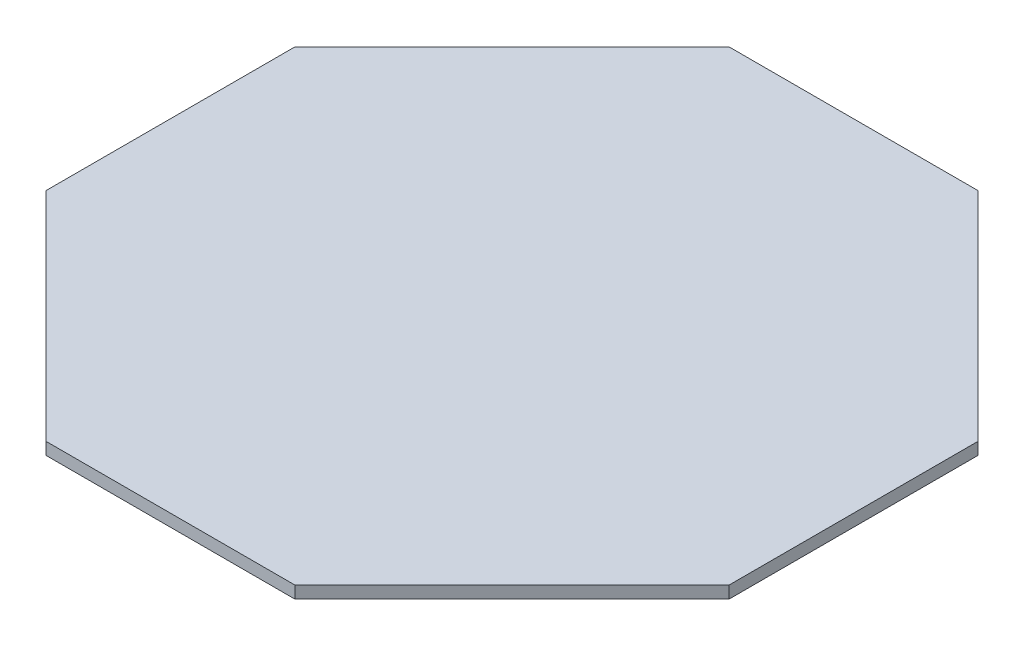
ISO-10303-21;
HEADER;
FILE_DESCRIPTION(('STEP AP214'),'2;1');
FILE_NAME('part.step','',(''),(''),'','','');
FILE_SCHEMA(('AUTOMOTIVE_DESIGN { 1 0 10303 214 1 1 1 1 }'));
ENDSEC;
DATA;
#1=APPLICATION_CONTEXT('core data for automotive mechanical design processes');
#2=APPLICATION_PROTOCOL_DEFINITION('international standard','automotive_design',2000,#1);
#3=PRODUCT_CONTEXT('',#1,'mechanical');
#4=PRODUCT('Part','Part','',(#3));
#5=PRODUCT_RELATED_PRODUCT_CATEGORY('part','',(#4));
#6=PRODUCT_DEFINITION_FORMATION('','',#4);
#7=PRODUCT_DEFINITION_CONTEXT('part definition',#1,'design');
#8=PRODUCT_DEFINITION('design','',#6,#7);
#9=PRODUCT_DEFINITION_SHAPE('','',#8);
#10=(LENGTH_UNIT() NAMED_UNIT(*) SI_UNIT(.MILLI.,.METRE.));
#11=(NAMED_UNIT(*) PLANE_ANGLE_UNIT() SI_UNIT($,.RADIAN.));
#12=(NAMED_UNIT(*) SI_UNIT($,.STERADIAN.) SOLID_ANGLE_UNIT());
#13=UNCERTAINTY_MEASURE_WITH_UNIT(LENGTH_MEASURE(1.E-05),#10,'distance_accuracy_value','');
#14=(GEOMETRIC_REPRESENTATION_CONTEXT(3) GLOBAL_UNCERTAINTY_ASSIGNED_CONTEXT((#13)) GLOBAL_UNIT_ASSIGNED_CONTEXT((#10,
#11,#12)) REPRESENTATION_CONTEXT('',''));
#15=CARTESIAN_POINT('',(0.,0.,0.));
#16=DIRECTION('',(0.,0.,1.));
#17=DIRECTION('',(1.,0.,0.));
#18=AXIS2_PLACEMENT_3D('',#15,#16,#17);
#19=CARTESIAN_POINT('',(-582.771529665369,2.875,-203.94755613606));
#20=DIRECTION('',(0.707106781186547,0.,0.707106781186548));
#21=DIRECTION('',(0.707106781186548,0.,-0.707106781186547));
#22=AXIS2_PLACEMENT_3D('',#19,#20,#21);
#23=PLANE('',#22);
#24=DIRECTION('',(-0.707106781186548,0.,0.707106781186547));
#25=VECTOR('',#24,1.);
#26=CARTESIAN_POINT('',(-582.771529665369,2.125,-203.94755613606));
#27=LINE('',#26,#25);
#28=CARTESIAN_POINT('',(-569.421529665369,2.125,-217.297556136059));
#29=VERTEX_POINT('',#28);
#30=CARTESIAN_POINT('',(-582.771529665369,2.125,-203.94755613606));
#31=VERTEX_POINT('',#30);
#32=EDGE_CURVE('E132',#29,#31,#27,.T.);
#33=ORIENTED_EDGE('',*,*,#32,.T.);
#34=DIRECTION('',(0.,-1.,0.));
#35=VECTOR('',#34,1.);
#36=CARTESIAN_POINT('',(-582.771529665369,2.875,-203.94755613606));
#37=LINE('',#36,#35);
#38=CARTESIAN_POINT('',(-582.771529665369,2.875,-203.94755613606));
#39=VERTEX_POINT('',#38);
#40=EDGE_CURVE('E11',#39,#31,#37,.T.);
#41=ORIENTED_EDGE('',*,*,#40,.F.);
#42=DIRECTION('',(-0.707106781186548,0.,0.707106781186547));
#43=VECTOR('',#42,1.);
#44=CARTESIAN_POINT('',(-582.771529665369,2.875,-203.94755613606));
#45=LINE('',#44,#43);
#46=CARTESIAN_POINT('',(-569.421529665369,2.875,-217.297556136059));
#47=VERTEX_POINT('',#46);
#48=EDGE_CURVE('E146',#47,#39,#45,.T.);
#49=ORIENTED_EDGE('',*,*,#48,.F.);
#50=DIRECTION('',(0.,-1.,0.));
#51=VECTOR('',#50,1.);
#52=CARTESIAN_POINT('',(-569.421529665369,2.875,-217.297556136059));
#53=LINE('',#52,#51);
#54=EDGE_CURVE('E128',#47,#29,#53,.T.);
#55=ORIENTED_EDGE('',*,*,#54,.T.);
#56=EDGE_LOOP('',(#33,#41,#49,#55));
#57=FACE_BOUND('',#56,.T.);
#58=ADVANCED_FACE('F36',(#57),#23,.F.);
#59=CARTESIAN_POINT('',(-582.771529665368,2.875,-188.64755613606));
#60=DIRECTION('',(1.,0.,0.));
#61=DIRECTION('',(0.,0.,-1.));
#62=AXIS2_PLACEMENT_3D('',#59,#60,#61);
#63=PLANE('',#62);
#64=DIRECTION('',(0.,0.,1.));
#65=VECTOR('',#64,1.);
#66=CARTESIAN_POINT('',(-582.771529665368,2.125,-188.64755613606));
#67=LINE('',#66,#65);
#68=CARTESIAN_POINT('',(-582.771529665368,2.125,-188.64755613606));
#69=VERTEX_POINT('',#68);
#70=EDGE_CURVE('E135',#31,#69,#67,.T.);
#71=ORIENTED_EDGE('',*,*,#70,.T.);
#72=DIRECTION('',(0.,-1.,0.));
#73=VECTOR('',#72,1.);
#74=CARTESIAN_POINT('',(-582.771529665368,2.875,-188.64755613606));
#75=LINE('',#74,#73);
#76=CARTESIAN_POINT('',(-582.771529665368,2.875,-188.64755613606));
#77=VERTEX_POINT('',#76);
#78=EDGE_CURVE('E44',#77,#69,#75,.T.);
#79=ORIENTED_EDGE('',*,*,#78,.F.);
#80=DIRECTION('',(0.,0.,1.));
#81=VECTOR('',#80,1.);
#82=CARTESIAN_POINT('',(-582.771529665368,2.875,-188.64755613606));
#83=LINE('',#82,#81);
#84=EDGE_CURVE('E95',#39,#77,#83,.T.);
#85=ORIENTED_EDGE('',*,*,#84,.F.);
#86=ORIENTED_EDGE('',*,*,#40,.T.);
#87=EDGE_LOOP('',(#71,#79,#85,#86));
#88=FACE_BOUND('',#87,.T.);
#89=ADVANCED_FACE('F181',(#88),#63,.F.);
#90=CARTESIAN_POINT('',(-582.771529665368,2.875,-188.64755613606));
#91=DIRECTION('',(0.707106781186563,0.,-0.707106781186533));
#92=DIRECTION('',(-0.707106781186533,0.,-0.707106781186563));
#93=AXIS2_PLACEMENT_3D('',#90,#91,#92);
#94=PLANE('',#93);
#95=DIRECTION('',(0.707106781186533,0.,0.707106781186563));
#96=VECTOR('',#95,1.);
#97=CARTESIAN_POINT('',(-582.771529665368,2.125,-188.64755613606));
#98=LINE('',#97,#96);
#99=CARTESIAN_POINT('',(-569.421529665369,2.125,-175.297556136059));
#100=VERTEX_POINT('',#99);
#101=EDGE_CURVE('E137',#69,#100,#98,.T.);
#102=ORIENTED_EDGE('',*,*,#101,.T.);
#103=DIRECTION('',(0.,-1.,0.));
#104=VECTOR('',#103,1.);
#105=CARTESIAN_POINT('',(-569.421529665369,2.875,-175.297556136059));
#106=LINE('',#105,#104);
#107=CARTESIAN_POINT('',(-569.421529665369,2.875,-175.297556136059));
#108=VERTEX_POINT('',#107);
#109=EDGE_CURVE('E153',#108,#100,#106,.T.);
#110=ORIENTED_EDGE('',*,*,#109,.F.);
#111=DIRECTION('',(0.707106781186533,0.,0.707106781186563));
#112=VECTOR('',#111,1.);
#113=CARTESIAN_POINT('',(-582.771529665368,2.875,-188.64755613606));
#114=LINE('',#113,#112);
#115=EDGE_CURVE('E161',#77,#108,#114,.T.);
#116=ORIENTED_EDGE('',*,*,#115,.F.);
#117=ORIENTED_EDGE('',*,*,#78,.T.);
#118=EDGE_LOOP('',(#102,#110,#116,#117));
#119=FACE_BOUND('',#118,.T.);
#120=ADVANCED_FACE('F159',(#119),#94,.F.);
#121=CARTESIAN_POINT('',(-569.421529665369,2.875,-175.297556136059));
#122=DIRECTION('',(0.,0.,-1.));
#123=DIRECTION('',(-1.,0.,0.));
#124=AXIS2_PLACEMENT_3D('',#121,#122,#123);
#125=PLANE('',#124);
#126=DIRECTION('',(1.,0.,0.));
#127=VECTOR('',#126,1.);
#128=CARTESIAN_POINT('',(-569.421529665369,2.125,-175.297556136059));
#129=LINE('',#128,#127);
#130=CARTESIAN_POINT('',(-554.121529665368,2.125,-175.297556136059));
#131=VERTEX_POINT('',#130);
#132=EDGE_CURVE('E139',#100,#131,#129,.T.);
#133=ORIENTED_EDGE('',*,*,#132,.T.);
#134=DIRECTION('',(0.,-1.,0.));
#135=VECTOR('',#134,1.);
#136=CARTESIAN_POINT('',(-554.121529665368,2.875,-175.297556136059));
#137=LINE('',#136,#135);
#138=CARTESIAN_POINT('',(-554.121529665368,2.875,-175.297556136059));
#139=VERTEX_POINT('',#138);
#140=EDGE_CURVE('E150',#139,#131,#137,.T.);
#141=ORIENTED_EDGE('',*,*,#140,.F.);
#142=DIRECTION('',(1.,0.,0.));
#143=VECTOR('',#142,1.);
#144=CARTESIAN_POINT('',(-569.421529665369,2.875,-175.297556136059));
#145=LINE('',#144,#143);
#146=EDGE_CURVE('E173',#108,#139,#145,.T.);
#147=ORIENTED_EDGE('',*,*,#146,.F.);
#148=ORIENTED_EDGE('',*,*,#109,.T.);
#149=EDGE_LOOP('',(#133,#141,#147,#148));
#150=FACE_BOUND('',#149,.T.);
#151=ADVANCED_FACE('F169',(#150),#125,.F.);
#152=CARTESIAN_POINT('',(-540.771529665369,2.875,-188.64755613606));
#153=DIRECTION('',(-0.707106781186565,0.,-0.70710678118653));
#154=DIRECTION('',(-0.70710678118653,0.,0.707106781186565));
#155=AXIS2_PLACEMENT_3D('',#152,#153,#154);
#156=PLANE('',#155);
#157=DIRECTION('',(0.70710678118653,0.,-0.707106781186565));
#158=VECTOR('',#157,1.);
#159=CARTESIAN_POINT('',(-540.771529665369,2.125,-188.64755613606));
#160=LINE('',#159,#158);
#161=CARTESIAN_POINT('',(-540.771529665369,2.125,-188.64755613606));
#162=VERTEX_POINT('',#161);
#163=EDGE_CURVE('E141',#131,#162,#160,.T.);
#164=ORIENTED_EDGE('',*,*,#163,.T.);
#165=DIRECTION('',(0.,-1.,0.));
#166=VECTOR('',#165,1.);
#167=CARTESIAN_POINT('',(-540.771529665369,2.875,-188.64755613606));
#168=LINE('',#167,#166);
#169=CARTESIAN_POINT('',(-540.771529665369,2.875,-188.64755613606));
#170=VERTEX_POINT('',#169);
#171=EDGE_CURVE('E123',#170,#162,#168,.T.);
#172=ORIENTED_EDGE('',*,*,#171,.F.);
#173=DIRECTION('',(0.70710678118653,0.,-0.707106781186565));
#174=VECTOR('',#173,1.);
#175=CARTESIAN_POINT('',(-540.771529665369,2.875,-188.64755613606));
#176=LINE('',#175,#174);
#177=EDGE_CURVE('E114',#139,#170,#176,.T.);
#178=ORIENTED_EDGE('',*,*,#177,.F.);
#179=ORIENTED_EDGE('',*,*,#140,.T.);
#180=EDGE_LOOP('',(#164,#172,#178,#179));
#181=FACE_BOUND('',#180,.T.);
#182=ADVANCED_FACE('F172',(#181),#156,.F.);
#183=CARTESIAN_POINT('',(-540.771529665369,2.875,-188.64755613606));
#184=DIRECTION('',(-1.,0.,0.));
#185=DIRECTION('',(0.,0.,1.));
#186=AXIS2_PLACEMENT_3D('',#183,#184,#185);
#187=PLANE('',#186);
#188=DIRECTION('',(0.,0.,-1.));
#189=VECTOR('',#188,1.);
#190=CARTESIAN_POINT('',(-540.771529665369,2.125,-188.64755613606));
#191=LINE('',#190,#189);
#192=CARTESIAN_POINT('',(-540.771529665369,2.125,-203.94755613606));
#193=VERTEX_POINT('',#192);
#194=EDGE_CURVE('E122',#162,#193,#191,.T.);
#195=ORIENTED_EDGE('',*,*,#194,.T.);
#196=DIRECTION('',(0.,-1.,0.));
#197=VECTOR('',#196,1.);
#198=CARTESIAN_POINT('',(-540.771529665369,2.875,-203.94755613606));
#199=LINE('',#198,#197);
#200=CARTESIAN_POINT('',(-540.771529665369,2.875,-203.94755613606));
#201=VERTEX_POINT('',#200);
#202=EDGE_CURVE('E119',#201,#193,#199,.T.);
#203=ORIENTED_EDGE('',*,*,#202,.F.);
#204=DIRECTION('',(0.,0.,-1.));
#205=VECTOR('',#204,1.);
#206=CARTESIAN_POINT('',(-540.771529665369,2.875,-188.64755613606));
#207=LINE('',#206,#205);
#208=EDGE_CURVE('E108',#170,#201,#207,.T.);
#209=ORIENTED_EDGE('',*,*,#208,.F.);
#210=ORIENTED_EDGE('',*,*,#171,.T.);
#211=EDGE_LOOP('',(#195,#203,#209,#210));
#212=FACE_BOUND('',#211,.T.);
#213=ADVANCED_FACE('F120',(#212),#187,.F.);
#214=CARTESIAN_POINT('',(-554.121529665368,2.875,-217.297556136059));
#215=DIRECTION('',(-0.707106781186544,0.,0.707106781186551));
#216=DIRECTION('',(0.707106781186551,0.,0.707106781186544));
#217=AXIS2_PLACEMENT_3D('',#214,#215,#216);
#218=PLANE('',#217);
#219=DIRECTION('',(-0.707106781186551,0.,-0.707106781186544));
#220=VECTOR('',#219,1.);
#221=CARTESIAN_POINT('',(-554.121529665368,2.125,-217.297556136059));
#222=LINE('',#221,#220);
#223=CARTESIAN_POINT('',(-554.121529665368,2.125,-217.297556136059));
#224=VERTEX_POINT('',#223);
#225=EDGE_CURVE('E81',#193,#224,#222,.T.);
#226=ORIENTED_EDGE('',*,*,#225,.T.);
#227=DIRECTION('',(0.,-1.,0.));
#228=VECTOR('',#227,1.);
#229=CARTESIAN_POINT('',(-554.121529665368,2.875,-217.297556136059));
#230=LINE('',#229,#228);
#231=CARTESIAN_POINT('',(-554.121529665368,2.875,-217.297556136059));
#232=VERTEX_POINT('',#231);
#233=EDGE_CURVE('E124',#232,#224,#230,.T.);
#234=ORIENTED_EDGE('',*,*,#233,.F.);
#235=DIRECTION('',(-0.707106781186551,0.,-0.707106781186544));
#236=VECTOR('',#235,1.);
#237=CARTESIAN_POINT('',(-554.121529665368,2.875,-217.297556136059));
#238=LINE('',#237,#236);
#239=EDGE_CURVE('E112',#201,#232,#238,.T.);
#240=ORIENTED_EDGE('',*,*,#239,.F.);
#241=ORIENTED_EDGE('',*,*,#202,.T.);
#242=EDGE_LOOP('',(#226,#234,#240,#241));
#243=FACE_BOUND('',#242,.T.);
#244=ADVANCED_FACE('F126',(#243),#218,.F.);
#245=CARTESIAN_POINT('',(-569.421529665369,2.875,-217.297556136059));
#246=DIRECTION('',(0.,0.,1.));
#247=DIRECTION('',(1.,0.,0.));
#248=AXIS2_PLACEMENT_3D('',#245,#246,#247);
#249=PLANE('',#248);
#250=DIRECTION('',(-1.,0.,0.));
#251=VECTOR('',#250,1.);
#252=CARTESIAN_POINT('',(-569.421529665369,2.125,-217.297556136059));
#253=LINE('',#252,#251);
#254=EDGE_CURVE('E87',#224,#29,#253,.T.);
#255=ORIENTED_EDGE('',*,*,#254,.T.);
#256=ORIENTED_EDGE('',*,*,#54,.F.);
#257=DIRECTION('',(-1.,0.,0.));
#258=VECTOR('',#257,1.);
#259=CARTESIAN_POINT('',(-569.421529665369,2.875,-217.297556136059));
#260=LINE('',#259,#258);
#261=EDGE_CURVE('E52',#232,#47,#260,.T.);
#262=ORIENTED_EDGE('',*,*,#261,.F.);
#263=ORIENTED_EDGE('',*,*,#233,.T.);
#264=EDGE_LOOP('',(#255,#256,#262,#263));
#265=FACE_BOUND('',#264,.T.);
#266=ADVANCED_FACE('F197',(#265),#249,.F.);
#267=CARTESIAN_POINT('',(-477.505800215563,2.875,-166.85292271565));
#268=DIRECTION('',(0.,-1.,0.));
#269=DIRECTION('',(0.,0.,-1.));
#270=AXIS2_PLACEMENT_3D('',#267,#268,#269);
#271=PLANE('',#270);
#272=ORIENTED_EDGE('',*,*,#48,.T.);
#273=ORIENTED_EDGE('',*,*,#84,.T.);
#274=ORIENTED_EDGE('',*,*,#115,.T.);
#275=ORIENTED_EDGE('',*,*,#146,.T.);
#276=ORIENTED_EDGE('',*,*,#177,.T.);
#277=ORIENTED_EDGE('',*,*,#208,.T.);
#278=ORIENTED_EDGE('',*,*,#239,.T.);
#279=ORIENTED_EDGE('',*,*,#261,.T.);
#280=EDGE_LOOP('',(#272,#273,#274,#275,#276,#277,#278,#279));
#281=FACE_BOUND('',#280,.T.);
#282=ADVANCED_FACE('F110',(#281),#271,.F.);
#283=CARTESIAN_POINT('',(-477.505800215563,2.125,-166.85292271565));
#284=DIRECTION('',(0.,-1.,0.));
#285=DIRECTION('',(0.,0.,-1.));
#286=AXIS2_PLACEMENT_3D('',#283,#284,#285);
#287=PLANE('',#286);
#288=ORIENTED_EDGE('',*,*,#32,.F.);
#289=ORIENTED_EDGE('',*,*,#254,.F.);
#290=ORIENTED_EDGE('',*,*,#225,.F.);
#291=ORIENTED_EDGE('',*,*,#194,.F.);
#292=ORIENTED_EDGE('',*,*,#163,.F.);
#293=ORIENTED_EDGE('',*,*,#132,.F.);
#294=ORIENTED_EDGE('',*,*,#101,.F.);
#295=ORIENTED_EDGE('',*,*,#70,.F.);
#296=EDGE_LOOP('',(#288,#289,#290,#291,#292,#293,#294,#295));
#297=FACE_BOUND('',#296,.T.);
#298=ADVANCED_FACE('F165',(#297),#287,.T.);
#299=CLOSED_SHELL('',(#58,#89,#120,#151,#182,#213,#244,#266,#282,#298));
#300=MANIFOLD_SOLID_BREP('B2',#299);
#301=ADVANCED_BREP_SHAPE_REPRESENTATION('',(#18,#300),#14);
#302=SHAPE_DEFINITION_REPRESENTATION(#9,#301);
ENDSEC;
END-ISO-10303-21;
